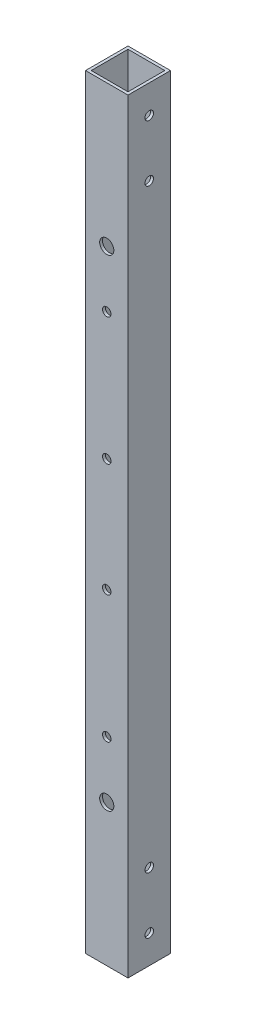
ISO-10303-21;
HEADER;
FILE_DESCRIPTION(('STEP AP214'),'2;1');
FILE_NAME('part.step','',(''),(''),'','','');
FILE_SCHEMA(('AUTOMOTIVE_DESIGN { 1 0 10303 214 1 1 1 1 }'));
ENDSEC;
DATA;
#1=APPLICATION_CONTEXT('core data for automotive mechanical design processes');
#2=APPLICATION_PROTOCOL_DEFINITION('international standard','automotive_design',2000,#1);
#3=PRODUCT_CONTEXT('',#1,'mechanical');
#4=PRODUCT('Part','Part','',(#3));
#5=PRODUCT_RELATED_PRODUCT_CATEGORY('part','',(#4));
#6=PRODUCT_DEFINITION_FORMATION('','',#4);
#7=PRODUCT_DEFINITION_CONTEXT('part definition',#1,'design');
#8=PRODUCT_DEFINITION('design','',#6,#7);
#9=PRODUCT_DEFINITION_SHAPE('','',#8);
#10=(LENGTH_UNIT() NAMED_UNIT(*) SI_UNIT(.MILLI.,.METRE.));
#11=(NAMED_UNIT(*) PLANE_ANGLE_UNIT() SI_UNIT($,.RADIAN.));
#12=(NAMED_UNIT(*) SI_UNIT($,.STERADIAN.) SOLID_ANGLE_UNIT());
#13=UNCERTAINTY_MEASURE_WITH_UNIT(LENGTH_MEASURE(1.E-05),#10,'distance_accuracy_value','');
#14=(GEOMETRIC_REPRESENTATION_CONTEXT(3) GLOBAL_UNCERTAINTY_ASSIGNED_CONTEXT((#13)) GLOBAL_UNIT_ASSIGNED_CONTEXT((#10,
#11,#12)) REPRESENTATION_CONTEXT('',''));
#15=CARTESIAN_POINT('',(0.,0.,0.));
#16=DIRECTION('',(0.,0.,1.));
#17=DIRECTION('',(1.,0.,0.));
#18=AXIS2_PLACEMENT_3D('',#15,#16,#17);
#19=CARTESIAN_POINT('',(0.,270.,0.));
#20=DIRECTION('',(0.,-1.,0.));
#21=DIRECTION('',(0.,0.,-1.));
#22=AXIS2_PLACEMENT_3D('',#19,#20,#21);
#23=PLANE('',#22);
#24=DIRECTION('',(0.,0.,-1.));
#25=VECTOR('',#24,1.);
#26=CARTESIAN_POINT('',(7.5,270.,7.5));
#27=LINE('',#26,#25);
#28=CARTESIAN_POINT('',(7.5,270.,7.5));
#29=VERTEX_POINT('',#28);
#30=CARTESIAN_POINT('',(7.5,270.,-7.5));
#31=VERTEX_POINT('',#30);
#32=EDGE_CURVE('E139',#29,#31,#27,.T.);
#33=ORIENTED_EDGE('',*,*,#32,.T.);
#34=DIRECTION('',(-1.,0.,0.));
#35=VECTOR('',#34,1.);
#36=CARTESIAN_POINT('',(-7.5,270.,-7.5));
#37=LINE('',#36,#35);
#38=CARTESIAN_POINT('',(-7.5,270.,-7.5));
#39=VERTEX_POINT('',#38);
#40=EDGE_CURVE('E142',#31,#39,#37,.T.);
#41=ORIENTED_EDGE('',*,*,#40,.T.);
#42=DIRECTION('',(0.,0.,1.));
#43=VECTOR('',#42,1.);
#44=CARTESIAN_POINT('',(-7.5,270.,7.5));
#45=LINE('',#44,#43);
#46=CARTESIAN_POINT('',(-7.5,270.,7.5));
#47=VERTEX_POINT('',#46);
#48=EDGE_CURVE('E145',#39,#47,#45,.T.);
#49=ORIENTED_EDGE('',*,*,#48,.T.);
#50=DIRECTION('',(1.,0.,0.));
#51=VECTOR('',#50,1.);
#52=CARTESIAN_POINT('',(-7.5,270.,7.5));
#53=LINE('',#52,#51);
#54=EDGE_CURVE('E147',#47,#29,#53,.T.);
#55=ORIENTED_EDGE('',*,*,#54,.T.);
#56=EDGE_LOOP('',(#33,#41,#49,#55));
#57=FACE_BOUND('',#56,.T.);
#58=DIRECTION('',(0.,0.,1.));
#59=VECTOR('',#58,1.);
#60=CARTESIAN_POINT('',(-6.5,270.,6.5));
#61=LINE('',#60,#59);
#62=CARTESIAN_POINT('',(-6.5,270.,-6.5));
#63=VERTEX_POINT('',#62);
#64=CARTESIAN_POINT('',(-6.5,270.,6.5));
#65=VERTEX_POINT('',#64);
#66=EDGE_CURVE('E101',#63,#65,#61,.T.);
#67=ORIENTED_EDGE('',*,*,#66,.F.);
#68=DIRECTION('',(-1.,0.,0.));
#69=VECTOR('',#68,1.);
#70=CARTESIAN_POINT('',(-6.5,270.,-6.5));
#71=LINE('',#70,#69);
#72=CARTESIAN_POINT('',(6.5,270.,-6.5));
#73=VERTEX_POINT('',#72);
#74=EDGE_CURVE('E123',#73,#63,#71,.T.);
#75=ORIENTED_EDGE('',*,*,#74,.F.);
#76=DIRECTION('',(0.,0.,-1.));
#77=VECTOR('',#76,1.);
#78=CARTESIAN_POINT('',(6.5,270.,6.5));
#79=LINE('',#78,#77);
#80=CARTESIAN_POINT('',(6.5,270.,6.5));
#81=VERTEX_POINT('',#80);
#82=EDGE_CURVE('E121',#81,#73,#79,.T.);
#83=ORIENTED_EDGE('',*,*,#82,.F.);
#84=DIRECTION('',(1.,0.,0.));
#85=VECTOR('',#84,1.);
#86=CARTESIAN_POINT('',(-6.5,270.,6.5));
#87=LINE('',#86,#85);
#88=EDGE_CURVE('E109',#65,#81,#87,.T.);
#89=ORIENTED_EDGE('',*,*,#88,.F.);
#90=EDGE_LOOP('',(#67,#75,#83,#89));
#91=FACE_BOUND('',#90,.T.);
#92=ADVANCED_FACE('F34',(#57,#91),#23,.F.);
#93=CARTESIAN_POINT('',(0.,0.,0.));
#94=DIRECTION('',(0.,-1.,0.));
#95=DIRECTION('',(0.,0.,-1.));
#96=AXIS2_PLACEMENT_3D('',#93,#94,#95);
#97=PLANE('',#96);
#98=DIRECTION('',(0.,0.,-1.));
#99=VECTOR('',#98,1.);
#100=CARTESIAN_POINT('',(7.5,0.,7.5));
#101=LINE('',#100,#99);
#102=CARTESIAN_POINT('',(7.5,0.,7.5));
#103=VERTEX_POINT('',#102);
#104=CARTESIAN_POINT('',(7.5,0.,-7.5));
#105=VERTEX_POINT('',#104);
#106=EDGE_CURVE('E117',#103,#105,#101,.T.);
#107=ORIENTED_EDGE('',*,*,#106,.F.);
#108=DIRECTION('',(1.,0.,0.));
#109=VECTOR('',#108,1.);
#110=CARTESIAN_POINT('',(-7.5,0.,7.5));
#111=LINE('',#110,#109);
#112=CARTESIAN_POINT('',(-7.5,0.,7.5));
#113=VERTEX_POINT('',#112);
#114=EDGE_CURVE('E143',#113,#103,#111,.T.);
#115=ORIENTED_EDGE('',*,*,#114,.F.);
#116=DIRECTION('',(0.,0.,1.));
#117=VECTOR('',#116,1.);
#118=CARTESIAN_POINT('',(-7.5,0.,7.5));
#119=LINE('',#118,#117);
#120=CARTESIAN_POINT('',(-7.5,0.,-7.5));
#121=VERTEX_POINT('',#120);
#122=EDGE_CURVE('E154',#121,#113,#119,.T.);
#123=ORIENTED_EDGE('',*,*,#122,.F.);
#124=DIRECTION('',(-1.,0.,0.));
#125=VECTOR('',#124,1.);
#126=CARTESIAN_POINT('',(-7.5,0.,-7.5));
#127=LINE('',#126,#125);
#128=EDGE_CURVE('E152',#105,#121,#127,.T.);
#129=ORIENTED_EDGE('',*,*,#128,.F.);
#130=EDGE_LOOP('',(#107,#115,#123,#129));
#131=FACE_BOUND('',#130,.T.);
#132=DIRECTION('',(-1.,0.,0.));
#133=VECTOR('',#132,1.);
#134=CARTESIAN_POINT('',(-6.5,0.,-6.5));
#135=LINE('',#134,#133);
#136=CARTESIAN_POINT('',(6.5,0.,-6.5));
#137=VERTEX_POINT('',#136);
#138=CARTESIAN_POINT('',(-6.5,0.,-6.5));
#139=VERTEX_POINT('',#138);
#140=EDGE_CURVE('E110',#137,#139,#135,.T.);
#141=ORIENTED_EDGE('',*,*,#140,.T.);
#142=DIRECTION('',(0.,0.,1.));
#143=VECTOR('',#142,1.);
#144=CARTESIAN_POINT('',(-6.5,0.,6.5));
#145=LINE('',#144,#143);
#146=CARTESIAN_POINT('',(-6.5,0.,6.5));
#147=VERTEX_POINT('',#146);
#148=EDGE_CURVE('E59',#139,#147,#145,.T.);
#149=ORIENTED_EDGE('',*,*,#148,.T.);
#150=DIRECTION('',(1.,0.,0.));
#151=VECTOR('',#150,1.);
#152=CARTESIAN_POINT('',(-6.5,0.,6.5));
#153=LINE('',#152,#151);
#154=CARTESIAN_POINT('',(6.5,0.,6.5));
#155=VERTEX_POINT('',#154);
#156=EDGE_CURVE('E116',#147,#155,#153,.T.);
#157=ORIENTED_EDGE('',*,*,#156,.T.);
#158=DIRECTION('',(0.,0.,-1.));
#159=VECTOR('',#158,1.);
#160=CARTESIAN_POINT('',(6.5,0.,6.5));
#161=LINE('',#160,#159);
#162=EDGE_CURVE('E131',#155,#137,#161,.T.);
#163=ORIENTED_EDGE('',*,*,#162,.T.);
#164=EDGE_LOOP('',(#141,#149,#157,#163));
#165=FACE_BOUND('',#164,.T.);
#166=ADVANCED_FACE('F289',(#131,#165),#97,.T.);
#167=CARTESIAN_POINT('',(7.5,270.,7.5));
#168=DIRECTION('',(-1.,0.,0.));
#169=DIRECTION('',(0.,0.,1.));
#170=AXIS2_PLACEMENT_3D('',#167,#168,#169);
#171=PLANE('',#170);
#172=CARTESIAN_POINT('',(7.5,260.,0.));
#173=DIRECTION('',(1.,0.,0.));
#174=DIRECTION('',(0.,0.,-1.));
#175=AXIS2_PLACEMENT_3D('',#172,#173,#174);
#176=CIRCLE('',#175,1.5);
#177=CARTESIAN_POINT('',(7.5,260.,-1.50000000000003));
#178=VERTEX_POINT('',#177);
#179=EDGE_CURVE('E418',#178,#178,#176,.T.);
#180=ORIENTED_EDGE('',*,*,#179,.F.);
#181=EDGE_LOOP('',(#180));
#182=FACE_BOUND('',#181,.T.);
#183=CARTESIAN_POINT('',(7.5,10.,0.));
#184=DIRECTION('',(1.,0.,0.));
#185=DIRECTION('',(0.,0.,-1.));
#186=AXIS2_PLACEMENT_3D('',#183,#184,#185);
#187=CIRCLE('',#186,1.5);
#188=CARTESIAN_POINT('',(7.5,10.,-1.50000000000003));
#189=VERTEX_POINT('',#188);
#190=EDGE_CURVE('E409',#189,#189,#187,.T.);
#191=ORIENTED_EDGE('',*,*,#190,.F.);
#192=EDGE_LOOP('',(#191));
#193=FACE_BOUND('',#192,.T.);
#194=CARTESIAN_POINT('',(7.5,30.,0.));
#195=DIRECTION('',(1.,0.,0.));
#196=DIRECTION('',(0.,0.,-1.));
#197=AXIS2_PLACEMENT_3D('',#194,#195,#196);
#198=CIRCLE('',#197,1.5);
#199=CARTESIAN_POINT('',(7.5,30.,-1.50000000000003));
#200=VERTEX_POINT('',#199);
#201=EDGE_CURVE('E210',#200,#200,#198,.T.);
#202=ORIENTED_EDGE('',*,*,#201,.F.);
#203=EDGE_LOOP('',(#202));
#204=FACE_BOUND('',#203,.T.);
#205=CARTESIAN_POINT('',(7.5,240.,0.));
#206=DIRECTION('',(1.,0.,0.));
#207=DIRECTION('',(0.,0.,-1.));
#208=AXIS2_PLACEMENT_3D('',#205,#206,#207);
#209=CIRCLE('',#208,1.5);
#210=CARTESIAN_POINT('',(7.5,240.,-1.50000000000003));
#211=VERTEX_POINT('',#210);
#212=EDGE_CURVE('E216',#211,#211,#209,.T.);
#213=ORIENTED_EDGE('',*,*,#212,.F.);
#214=EDGE_LOOP('',(#213));
#215=FACE_BOUND('',#214,.T.);
#216=ORIENTED_EDGE('',*,*,#106,.T.);
#217=DIRECTION('',(0.,-1.,0.));
#218=VECTOR('',#217,1.);
#219=CARTESIAN_POINT('',(7.5,270.,-7.5));
#220=LINE('',#219,#218);
#221=EDGE_CURVE('E11',#31,#105,#220,.T.);
#222=ORIENTED_EDGE('',*,*,#221,.F.);
#223=ORIENTED_EDGE('',*,*,#32,.F.);
#224=DIRECTION('',(0.,-1.,0.));
#225=VECTOR('',#224,1.);
#226=CARTESIAN_POINT('',(7.5,270.,7.5));
#227=LINE('',#226,#225);
#228=EDGE_CURVE('E149',#29,#103,#227,.T.);
#229=ORIENTED_EDGE('',*,*,#228,.T.);
#230=EDGE_LOOP('',(#216,#222,#223,#229));
#231=FACE_BOUND('',#230,.T.);
#232=ADVANCED_FACE('F36',(#182,#193,#204,#215,#231),#171,.F.);
#233=CARTESIAN_POINT('',(-7.5,270.,-7.5));
#234=DIRECTION('',(0.,0.,1.));
#235=DIRECTION('',(1.,0.,0.));
#236=AXIS2_PLACEMENT_3D('',#233,#234,#235);
#237=PLANE('',#236);
#238=CARTESIAN_POINT('',(0.,70.,-7.5));
#239=DIRECTION('',(0.,0.,1.));
#240=DIRECTION('',(1.,0.,0.));
#241=AXIS2_PLACEMENT_3D('',#238,#239,#240);
#242=CIRCLE('',#241,1.5);
#243=CARTESIAN_POINT('',(1.50000000000001,70.,-7.5));
#244=VERTEX_POINT('',#243);
#245=EDGE_CURVE('E236',#244,#244,#242,.T.);
#246=ORIENTED_EDGE('',*,*,#245,.T.);
#247=EDGE_LOOP('',(#246));
#248=FACE_BOUND('',#247,.T.);
#249=CARTESIAN_POINT('',(0.,220.,-7.5));
#250=DIRECTION('',(0.,0.,1.));
#251=DIRECTION('',(1.,0.,0.));
#252=AXIS2_PLACEMENT_3D('',#249,#250,#251);
#253=CIRCLE('',#252,2.5);
#254=CARTESIAN_POINT('',(2.50000000000001,220.,-7.5));
#255=VERTEX_POINT('',#254);
#256=EDGE_CURVE('E224',#255,#255,#253,.T.);
#257=ORIENTED_EDGE('',*,*,#256,.T.);
#258=EDGE_LOOP('',(#257));
#259=FACE_BOUND('',#258,.T.);
#260=CARTESIAN_POINT('',(0.,50.,-7.5));
#261=DIRECTION('',(0.,0.,1.));
#262=DIRECTION('',(-1.,0.,0.));
#263=AXIS2_PLACEMENT_3D('',#260,#261,#262);
#264=CIRCLE('',#263,2.5);
#265=CARTESIAN_POINT('',(-2.5,50.,-7.5));
#266=VERTEX_POINT('',#265);
#267=EDGE_CURVE('E231',#266,#266,#264,.T.);
#268=ORIENTED_EDGE('',*,*,#267,.T.);
#269=EDGE_LOOP('',(#268));
#270=FACE_BOUND('',#269,.T.);
#271=CARTESIAN_POINT('',(0.,200.,-7.5));
#272=DIRECTION('',(0.,0.,1.));
#273=DIRECTION('',(1.,0.,0.));
#274=AXIS2_PLACEMENT_3D('',#271,#272,#273);
#275=CIRCLE('',#274,1.5);
#276=CARTESIAN_POINT('',(1.50000000000001,200.,-7.5));
#277=VERTEX_POINT('',#276);
#278=EDGE_CURVE('E247',#277,#277,#275,.T.);
#279=ORIENTED_EDGE('',*,*,#278,.T.);
#280=EDGE_LOOP('',(#279));
#281=FACE_BOUND('',#280,.T.);
#282=CARTESIAN_POINT('',(0.,115.,-7.5));
#283=DIRECTION('',(0.,0.,1.));
#284=DIRECTION('',(1.,0.,0.));
#285=AXIS2_PLACEMENT_3D('',#282,#283,#284);
#286=CIRCLE('',#285,1.5);
#287=CARTESIAN_POINT('',(1.50000000000002,115.,-7.5));
#288=VERTEX_POINT('',#287);
#289=EDGE_CURVE('E172',#288,#288,#286,.T.);
#290=ORIENTED_EDGE('',*,*,#289,.T.);
#291=EDGE_LOOP('',(#290));
#292=FACE_BOUND('',#291,.T.);
#293=CARTESIAN_POINT('',(0.,155.,-7.5));
#294=DIRECTION('',(0.,0.,1.));
#295=DIRECTION('',(1.,0.,0.));
#296=AXIS2_PLACEMENT_3D('',#293,#294,#295);
#297=CIRCLE('',#296,1.5);
#298=CARTESIAN_POINT('',(1.50000000000002,155.,-7.5));
#299=VERTEX_POINT('',#298);
#300=EDGE_CURVE('E167',#299,#299,#297,.T.);
#301=ORIENTED_EDGE('',*,*,#300,.T.);
#302=EDGE_LOOP('',(#301));
#303=FACE_BOUND('',#302,.T.);
#304=ORIENTED_EDGE('',*,*,#128,.T.);
#305=DIRECTION('',(0.,-1.,0.));
#306=VECTOR('',#305,1.);
#307=CARTESIAN_POINT('',(-7.5,270.,-7.5));
#308=LINE('',#307,#306);
#309=EDGE_CURVE('E43',#39,#121,#308,.T.);
#310=ORIENTED_EDGE('',*,*,#309,.F.);
#311=ORIENTED_EDGE('',*,*,#40,.F.);
#312=ORIENTED_EDGE('',*,*,#221,.T.);
#313=EDGE_LOOP('',(#304,#310,#311,#312));
#314=FACE_BOUND('',#313,.T.);
#315=ADVANCED_FACE('F303',(#248,#259,#270,#281,#292,#303,#314),#237,.F.);
#316=CARTESIAN_POINT('',(-7.5,270.,7.5));
#317=DIRECTION('',(1.,0.,0.));
#318=DIRECTION('',(0.,0.,-1.));
#319=AXIS2_PLACEMENT_3D('',#316,#317,#318);
#320=PLANE('',#319);
#321=CARTESIAN_POINT('',(-7.5,260.,0.));
#322=DIRECTION('',(1.,0.,0.));
#323=DIRECTION('',(0.,0.,-1.));
#324=AXIS2_PLACEMENT_3D('',#321,#322,#323);
#325=CIRCLE('',#324,1.5);
#326=CARTESIAN_POINT('',(-7.5,260.,-1.50000000000003));
#327=VERTEX_POINT('',#326);
#328=EDGE_CURVE('E413',#327,#327,#325,.T.);
#329=ORIENTED_EDGE('',*,*,#328,.T.);
#330=EDGE_LOOP('',(#329));
#331=FACE_BOUND('',#330,.T.);
#332=CARTESIAN_POINT('',(-7.5,10.,0.));
#333=DIRECTION('',(1.,0.,0.));
#334=DIRECTION('',(0.,0.,-1.));
#335=AXIS2_PLACEMENT_3D('',#332,#333,#334);
#336=CIRCLE('',#335,1.5);
#337=CARTESIAN_POINT('',(-7.5,10.,-1.50000000000003));
#338=VERTEX_POINT('',#337);
#339=EDGE_CURVE('E407',#338,#338,#336,.T.);
#340=ORIENTED_EDGE('',*,*,#339,.T.);
#341=EDGE_LOOP('',(#340));
#342=FACE_BOUND('',#341,.T.);
#343=CARTESIAN_POINT('',(-7.5,30.,0.));
#344=DIRECTION('',(1.,0.,0.));
#345=DIRECTION('',(0.,0.,-1.));
#346=AXIS2_PLACEMENT_3D('',#343,#344,#345);
#347=CIRCLE('',#346,1.5);
#348=CARTESIAN_POINT('',(-7.5,30.,-1.50000000000003));
#349=VERTEX_POINT('',#348);
#350=EDGE_CURVE('E197',#349,#349,#347,.T.);
#351=ORIENTED_EDGE('',*,*,#350,.T.);
#352=EDGE_LOOP('',(#351));
#353=FACE_BOUND('',#352,.T.);
#354=CARTESIAN_POINT('',(-7.5,240.,0.));
#355=DIRECTION('',(1.,0.,0.));
#356=DIRECTION('',(0.,0.,-1.));
#357=AXIS2_PLACEMENT_3D('',#354,#355,#356);
#358=CIRCLE('',#357,1.5);
#359=CARTESIAN_POINT('',(-7.5,240.,-1.50000000000003));
#360=VERTEX_POINT('',#359);
#361=EDGE_CURVE('E193',#360,#360,#358,.T.);
#362=ORIENTED_EDGE('',*,*,#361,.T.);
#363=EDGE_LOOP('',(#362));
#364=FACE_BOUND('',#363,.T.);
#365=ORIENTED_EDGE('',*,*,#122,.T.);
#366=DIRECTION('',(0.,-1.,0.));
#367=VECTOR('',#366,1.);
#368=CARTESIAN_POINT('',(-7.5,270.,7.5));
#369=LINE('',#368,#367);
#370=EDGE_CURVE('E159',#47,#113,#369,.T.);
#371=ORIENTED_EDGE('',*,*,#370,.F.);
#372=ORIENTED_EDGE('',*,*,#48,.F.);
#373=ORIENTED_EDGE('',*,*,#309,.T.);
#374=EDGE_LOOP('',(#365,#371,#372,#373));
#375=FACE_BOUND('',#374,.T.);
#376=ADVANCED_FACE('F300',(#331,#342,#353,#364,#375),#320,.F.);
#377=CARTESIAN_POINT('',(-7.5,270.,7.5));
#378=DIRECTION('',(0.,0.,-1.));
#379=DIRECTION('',(-1.,0.,0.));
#380=AXIS2_PLACEMENT_3D('',#377,#378,#379);
#381=PLANE('',#380);
#382=CARTESIAN_POINT('',(0.,70.,7.5));
#383=DIRECTION('',(0.,0.,1.));
#384=DIRECTION('',(1.,0.,0.));
#385=AXIS2_PLACEMENT_3D('',#382,#383,#384);
#386=CIRCLE('',#385,1.5);
#387=CARTESIAN_POINT('',(1.50000000000001,70.,7.5));
#388=VERTEX_POINT('',#387);
#389=EDGE_CURVE('E227',#388,#388,#386,.T.);
#390=ORIENTED_EDGE('',*,*,#389,.F.);
#391=EDGE_LOOP('',(#390));
#392=FACE_BOUND('',#391,.T.);
#393=CARTESIAN_POINT('',(0.,220.,7.5));
#394=DIRECTION('',(0.,0.,1.));
#395=DIRECTION('',(1.,0.,0.));
#396=AXIS2_PLACEMENT_3D('',#393,#394,#395);
#397=CIRCLE('',#396,2.5);
#398=CARTESIAN_POINT('',(2.50000000000001,220.,7.5));
#399=VERTEX_POINT('',#398);
#400=EDGE_CURVE('E228',#399,#399,#397,.T.);
#401=ORIENTED_EDGE('',*,*,#400,.F.);
#402=EDGE_LOOP('',(#401));
#403=FACE_BOUND('',#402,.T.);
#404=CARTESIAN_POINT('',(0.,50.,7.5));
#405=DIRECTION('',(0.,0.,1.));
#406=DIRECTION('',(-1.,0.,0.));
#407=AXIS2_PLACEMENT_3D('',#404,#405,#406);
#408=CIRCLE('',#407,2.5);
#409=CARTESIAN_POINT('',(-2.5,50.,7.5));
#410=VERTEX_POINT('',#409);
#411=EDGE_CURVE('E223',#410,#410,#408,.T.);
#412=ORIENTED_EDGE('',*,*,#411,.F.);
#413=EDGE_LOOP('',(#412));
#414=FACE_BOUND('',#413,.T.);
#415=CARTESIAN_POINT('',(0.,200.,7.5));
#416=DIRECTION('',(0.,0.,1.));
#417=DIRECTION('',(1.,0.,0.));
#418=AXIS2_PLACEMENT_3D('',#415,#416,#417);
#419=CIRCLE('',#418,1.5);
#420=CARTESIAN_POINT('',(1.50000000000001,200.,7.5));
#421=VERTEX_POINT('',#420);
#422=EDGE_CURVE('E239',#421,#421,#419,.T.);
#423=ORIENTED_EDGE('',*,*,#422,.F.);
#424=EDGE_LOOP('',(#423));
#425=FACE_BOUND('',#424,.T.);
#426=CARTESIAN_POINT('',(0.,115.,7.5));
#427=DIRECTION('',(0.,0.,1.));
#428=DIRECTION('',(1.,0.,0.));
#429=AXIS2_PLACEMENT_3D('',#426,#427,#428);
#430=CIRCLE('',#429,1.5);
#431=CARTESIAN_POINT('',(1.50000000000002,115.,7.5));
#432=VERTEX_POINT('',#431);
#433=EDGE_CURVE('E244',#432,#432,#430,.T.);
#434=ORIENTED_EDGE('',*,*,#433,.F.);
#435=EDGE_LOOP('',(#434));
#436=FACE_BOUND('',#435,.T.);
#437=CARTESIAN_POINT('',(0.,155.,7.5));
#438=DIRECTION('',(0.,0.,1.));
#439=DIRECTION('',(1.,0.,0.));
#440=AXIS2_PLACEMENT_3D('',#437,#438,#439);
#441=CIRCLE('',#440,1.5);
#442=CARTESIAN_POINT('',(1.50000000000002,155.,7.5));
#443=VERTEX_POINT('',#442);
#444=EDGE_CURVE('E262',#443,#443,#441,.T.);
#445=ORIENTED_EDGE('',*,*,#444,.F.);
#446=EDGE_LOOP('',(#445));
#447=FACE_BOUND('',#446,.T.);
#448=ORIENTED_EDGE('',*,*,#114,.T.);
#449=ORIENTED_EDGE('',*,*,#228,.F.);
#450=ORIENTED_EDGE('',*,*,#54,.F.);
#451=ORIENTED_EDGE('',*,*,#370,.T.);
#452=EDGE_LOOP('',(#448,#449,#450,#451));
#453=FACE_BOUND('',#452,.T.);
#454=ADVANCED_FACE('F283',(#392,#403,#414,#425,#436,#447,#453),#381,.F.);
#455=CARTESIAN_POINT('',(-6.5,270.,6.5));
#456=DIRECTION('',(1.,0.,0.));
#457=DIRECTION('',(0.,0.,-1.));
#458=AXIS2_PLACEMENT_3D('',#455,#456,#457);
#459=PLANE('',#458);
#460=CARTESIAN_POINT('',(-6.5,260.,0.));
#461=DIRECTION('',(1.,0.,0.));
#462=DIRECTION('',(0.,0.,-1.));
#463=AXIS2_PLACEMENT_3D('',#460,#461,#462);
#464=CIRCLE('',#463,1.5);
#465=CARTESIAN_POINT('',(-6.5,260.,-1.50000000000003));
#466=VERTEX_POINT('',#465);
#467=EDGE_CURVE('E213',#466,#466,#464,.T.);
#468=ORIENTED_EDGE('',*,*,#467,.F.);
#469=EDGE_LOOP('',(#468));
#470=FACE_BOUND('',#469,.T.);
#471=CARTESIAN_POINT('',(-6.5,10.,0.));
#472=DIRECTION('',(1.,0.,0.));
#473=DIRECTION('',(0.,0.,-1.));
#474=AXIS2_PLACEMENT_3D('',#471,#472,#473);
#475=CIRCLE('',#474,1.5);
#476=CARTESIAN_POINT('',(-6.5,10.,-1.50000000000003));
#477=VERTEX_POINT('',#476);
#478=EDGE_CURVE('E200',#477,#477,#475,.T.);
#479=ORIENTED_EDGE('',*,*,#478,.F.);
#480=EDGE_LOOP('',(#479));
#481=FACE_BOUND('',#480,.T.);
#482=CARTESIAN_POINT('',(-6.5,30.,0.));
#483=DIRECTION('',(1.,0.,0.));
#484=DIRECTION('',(0.,0.,-1.));
#485=AXIS2_PLACEMENT_3D('',#482,#483,#484);
#486=CIRCLE('',#485,1.5);
#487=CARTESIAN_POINT('',(-6.5,30.,-1.50000000000003));
#488=VERTEX_POINT('',#487);
#489=EDGE_CURVE('E196',#488,#488,#486,.T.);
#490=ORIENTED_EDGE('',*,*,#489,.F.);
#491=EDGE_LOOP('',(#490));
#492=FACE_BOUND('',#491,.T.);
#493=CARTESIAN_POINT('',(-6.5,240.,0.));
#494=DIRECTION('',(1.,0.,0.));
#495=DIRECTION('',(0.,0.,-1.));
#496=AXIS2_PLACEMENT_3D('',#493,#494,#495);
#497=CIRCLE('',#496,1.5);
#498=CARTESIAN_POINT('',(-6.5,240.,-1.50000000000003));
#499=VERTEX_POINT('',#498);
#500=EDGE_CURVE('E192',#499,#499,#497,.T.);
#501=ORIENTED_EDGE('',*,*,#500,.F.);
#502=EDGE_LOOP('',(#501));
#503=FACE_BOUND('',#502,.T.);
#504=ORIENTED_EDGE('',*,*,#148,.F.);
#505=DIRECTION('',(0.,-1.,0.));
#506=VECTOR('',#505,1.);
#507=CARTESIAN_POINT('',(-6.5,270.,-6.5));
#508=LINE('',#507,#506);
#509=EDGE_CURVE('E105',#63,#139,#508,.T.);
#510=ORIENTED_EDGE('',*,*,#509,.F.);
#511=ORIENTED_EDGE('',*,*,#66,.T.);
#512=DIRECTION('',(0.,-1.,0.));
#513=VECTOR('',#512,1.);
#514=CARTESIAN_POINT('',(-6.5,270.,6.5));
#515=LINE('',#514,#513);
#516=EDGE_CURVE('E104',#65,#147,#515,.T.);
#517=ORIENTED_EDGE('',*,*,#516,.T.);
#518=EDGE_LOOP('',(#504,#510,#511,#517));
#519=FACE_BOUND('',#518,.T.);
#520=ADVANCED_FACE('F103',(#470,#481,#492,#503,#519),#459,.T.);
#521=CARTESIAN_POINT('',(-6.5,270.,6.5));
#522=DIRECTION('',(0.,0.,-1.));
#523=DIRECTION('',(-1.,0.,0.));
#524=AXIS2_PLACEMENT_3D('',#521,#522,#523);
#525=PLANE('',#524);
#526=CARTESIAN_POINT('',(0.,70.,6.5));
#527=DIRECTION('',(0.,0.,-1.));
#528=DIRECTION('',(-1.,0.,0.));
#529=AXIS2_PLACEMENT_3D('',#526,#527,#528);
#530=CIRCLE('',#529,1.5);
#531=CARTESIAN_POINT('',(-1.49999999999999,70.,6.5));
#532=VERTEX_POINT('',#531);
#533=EDGE_CURVE('E188',#532,#532,#530,.T.);
#534=ORIENTED_EDGE('',*,*,#533,.F.);
#535=EDGE_LOOP('',(#534));
#536=FACE_BOUND('',#535,.T.);
#537=CARTESIAN_POINT('',(0.,220.,6.5));
#538=DIRECTION('',(0.,0.,-1.));
#539=DIRECTION('',(-1.,0.,0.));
#540=AXIS2_PLACEMENT_3D('',#537,#538,#539);
#541=CIRCLE('',#540,2.5);
#542=CARTESIAN_POINT('',(-2.5,220.,6.5));
#543=VERTEX_POINT('',#542);
#544=EDGE_CURVE('E184',#543,#543,#541,.T.);
#545=ORIENTED_EDGE('',*,*,#544,.F.);
#546=EDGE_LOOP('',(#545));
#547=FACE_BOUND('',#546,.T.);
#548=CARTESIAN_POINT('',(0.,50.,6.5));
#549=DIRECTION('',(0.,0.,-1.));
#550=DIRECTION('',(-1.,0.,0.));
#551=AXIS2_PLACEMENT_3D('',#548,#549,#550);
#552=CIRCLE('',#551,2.5);
#553=CARTESIAN_POINT('',(-2.5,50.,6.5));
#554=VERTEX_POINT('',#553);
#555=EDGE_CURVE('E180',#554,#554,#552,.T.);
#556=ORIENTED_EDGE('',*,*,#555,.F.);
#557=EDGE_LOOP('',(#556));
#558=FACE_BOUND('',#557,.T.);
#559=CARTESIAN_POINT('',(0.,200.,6.5));
#560=DIRECTION('',(0.,0.,-1.));
#561=DIRECTION('',(-1.,0.,0.));
#562=AXIS2_PLACEMENT_3D('',#559,#560,#561);
#563=CIRCLE('',#562,1.5);
#564=CARTESIAN_POINT('',(-1.49999999999999,200.,6.5));
#565=VERTEX_POINT('',#564);
#566=EDGE_CURVE('E176',#565,#565,#563,.T.);
#567=ORIENTED_EDGE('',*,*,#566,.F.);
#568=EDGE_LOOP('',(#567));
#569=FACE_BOUND('',#568,.T.);
#570=CARTESIAN_POINT('',(0.,115.,6.5));
#571=DIRECTION('',(0.,0.,-1.));
#572=DIRECTION('',(-1.,0.,0.));
#573=AXIS2_PLACEMENT_3D('',#570,#571,#572);
#574=CIRCLE('',#573,1.5);
#575=CARTESIAN_POINT('',(-1.49999999999998,115.,6.5));
#576=VERTEX_POINT('',#575);
#577=EDGE_CURVE('E171',#576,#576,#574,.T.);
#578=ORIENTED_EDGE('',*,*,#577,.F.);
#579=EDGE_LOOP('',(#578));
#580=FACE_BOUND('',#579,.T.);
#581=CARTESIAN_POINT('',(0.,155.,6.5));
#582=DIRECTION('',(0.,0.,-1.));
#583=DIRECTION('',(-1.,0.,0.));
#584=AXIS2_PLACEMENT_3D('',#581,#582,#583);
#585=CIRCLE('',#584,1.5);
#586=CARTESIAN_POINT('',(-1.49999999999998,155.,6.5));
#587=VERTEX_POINT('',#586);
#588=EDGE_CURVE('E129',#587,#587,#585,.T.);
#589=ORIENTED_EDGE('',*,*,#588,.F.);
#590=EDGE_LOOP('',(#589));
#591=FACE_BOUND('',#590,.T.);
#592=ORIENTED_EDGE('',*,*,#156,.F.);
#593=ORIENTED_EDGE('',*,*,#516,.F.);
#594=ORIENTED_EDGE('',*,*,#88,.T.);
#595=DIRECTION('',(0.,-1.,0.));
#596=VECTOR('',#595,1.);
#597=CARTESIAN_POINT('',(6.5,270.,6.5));
#598=LINE('',#597,#596);
#599=EDGE_CURVE('E118',#81,#155,#598,.T.);
#600=ORIENTED_EDGE('',*,*,#599,.T.);
#601=EDGE_LOOP('',(#592,#593,#594,#600));
#602=FACE_BOUND('',#601,.T.);
#603=ADVANCED_FACE('F113',(#536,#547,#558,#569,#580,#591,#602),#525,.T.);
#604=CARTESIAN_POINT('',(6.5,270.,6.5));
#605=DIRECTION('',(-1.,0.,0.));
#606=DIRECTION('',(0.,0.,1.));
#607=AXIS2_PLACEMENT_3D('',#604,#605,#606);
#608=PLANE('',#607);
#609=CARTESIAN_POINT('',(6.5,260.,0.));
#610=DIRECTION('',(-1.,0.,0.));
#611=DIRECTION('',(0.,0.,1.));
#612=AXIS2_PLACEMENT_3D('',#609,#610,#611);
#613=CIRCLE('',#612,1.5);
#614=CARTESIAN_POINT('',(6.5,260.,1.49999999999997));
#615=VERTEX_POINT('',#614);
#616=EDGE_CURVE('E38',#615,#615,#613,.T.);
#617=ORIENTED_EDGE('',*,*,#616,.F.);
#618=EDGE_LOOP('',(#617));
#619=FACE_BOUND('',#618,.T.);
#620=CARTESIAN_POINT('',(6.5,10.,0.));
#621=DIRECTION('',(-1.,0.,0.));
#622=DIRECTION('',(0.,0.,1.));
#623=AXIS2_PLACEMENT_3D('',#620,#621,#622);
#624=CIRCLE('',#623,1.5);
#625=CARTESIAN_POINT('',(6.5,10.,1.49999999999997));
#626=VERTEX_POINT('',#625);
#627=EDGE_CURVE('E198',#626,#626,#624,.T.);
#628=ORIENTED_EDGE('',*,*,#627,.F.);
#629=EDGE_LOOP('',(#628));
#630=FACE_BOUND('',#629,.T.);
#631=CARTESIAN_POINT('',(6.5,30.,0.));
#632=DIRECTION('',(-1.,0.,0.));
#633=DIRECTION('',(0.,0.,1.));
#634=AXIS2_PLACEMENT_3D('',#631,#632,#633);
#635=CIRCLE('',#634,1.5);
#636=CARTESIAN_POINT('',(6.5,30.,1.49999999999997));
#637=VERTEX_POINT('',#636);
#638=EDGE_CURVE('E194',#637,#637,#635,.T.);
#639=ORIENTED_EDGE('',*,*,#638,.F.);
#640=EDGE_LOOP('',(#639));
#641=FACE_BOUND('',#640,.T.);
#642=CARTESIAN_POINT('',(6.5,240.,0.));
#643=DIRECTION('',(-1.,0.,0.));
#644=DIRECTION('',(0.,0.,1.));
#645=AXIS2_PLACEMENT_3D('',#642,#643,#644);
#646=CIRCLE('',#645,1.5);
#647=CARTESIAN_POINT('',(6.5,240.,1.49999999999997));
#648=VERTEX_POINT('',#647);
#649=EDGE_CURVE('E189',#648,#648,#646,.T.);
#650=ORIENTED_EDGE('',*,*,#649,.F.);
#651=EDGE_LOOP('',(#650));
#652=FACE_BOUND('',#651,.T.);
#653=ORIENTED_EDGE('',*,*,#162,.F.);
#654=ORIENTED_EDGE('',*,*,#599,.F.);
#655=ORIENTED_EDGE('',*,*,#82,.T.);
#656=DIRECTION('',(0.,-1.,0.));
#657=VECTOR('',#656,1.);
#658=CARTESIAN_POINT('',(6.5,270.,-6.5));
#659=LINE('',#658,#657);
#660=EDGE_CURVE('E51',#73,#137,#659,.T.);
#661=ORIENTED_EDGE('',*,*,#660,.T.);
#662=EDGE_LOOP('',(#653,#654,#655,#661));
#663=FACE_BOUND('',#662,.T.);
#664=ADVANCED_FACE('F273',(#619,#630,#641,#652,#663),#608,.T.);
#665=CARTESIAN_POINT('',(-6.5,270.,-6.5));
#666=DIRECTION('',(0.,0.,1.));
#667=DIRECTION('',(1.,0.,0.));
#668=AXIS2_PLACEMENT_3D('',#665,#666,#667);
#669=PLANE('',#668);
#670=CARTESIAN_POINT('',(0.,70.,-6.5));
#671=DIRECTION('',(0.,0.,1.));
#672=DIRECTION('',(1.,0.,0.));
#673=AXIS2_PLACEMENT_3D('',#670,#671,#672);
#674=CIRCLE('',#673,1.5);
#675=CARTESIAN_POINT('',(1.50000000000001,70.,-6.5));
#676=VERTEX_POINT('',#675);
#677=EDGE_CURVE('E185',#676,#676,#674,.T.);
#678=ORIENTED_EDGE('',*,*,#677,.F.);
#679=EDGE_LOOP('',(#678));
#680=FACE_BOUND('',#679,.T.);
#681=CARTESIAN_POINT('',(0.,220.,-6.5));
#682=DIRECTION('',(0.,0.,1.));
#683=DIRECTION('',(1.,0.,0.));
#684=AXIS2_PLACEMENT_3D('',#681,#682,#683);
#685=CIRCLE('',#684,2.5);
#686=CARTESIAN_POINT('',(2.50000000000001,220.,-6.5));
#687=VERTEX_POINT('',#686);
#688=EDGE_CURVE('E181',#687,#687,#685,.T.);
#689=ORIENTED_EDGE('',*,*,#688,.F.);
#690=EDGE_LOOP('',(#689));
#691=FACE_BOUND('',#690,.T.);
#692=CARTESIAN_POINT('',(0.,50.,-6.5));
#693=DIRECTION('',(0.,0.,1.));
#694=DIRECTION('',(1.,0.,0.));
#695=AXIS2_PLACEMENT_3D('',#692,#693,#694);
#696=CIRCLE('',#695,2.5);
#697=CARTESIAN_POINT('',(2.50000000000001,50.,-6.5));
#698=VERTEX_POINT('',#697);
#699=EDGE_CURVE('E177',#698,#698,#696,.T.);
#700=ORIENTED_EDGE('',*,*,#699,.F.);
#701=EDGE_LOOP('',(#700));
#702=FACE_BOUND('',#701,.T.);
#703=CARTESIAN_POINT('',(0.,200.,-6.5));
#704=DIRECTION('',(0.,0.,1.));
#705=DIRECTION('',(1.,0.,0.));
#706=AXIS2_PLACEMENT_3D('',#703,#704,#705);
#707=CIRCLE('',#706,1.5);
#708=CARTESIAN_POINT('',(1.50000000000001,200.,-6.5));
#709=VERTEX_POINT('',#708);
#710=EDGE_CURVE('E173',#709,#709,#707,.T.);
#711=ORIENTED_EDGE('',*,*,#710,.F.);
#712=EDGE_LOOP('',(#711));
#713=FACE_BOUND('',#712,.T.);
#714=CARTESIAN_POINT('',(0.,115.,-6.5));
#715=DIRECTION('',(0.,0.,1.));
#716=DIRECTION('',(1.,0.,0.));
#717=AXIS2_PLACEMENT_3D('',#714,#715,#716);
#718=CIRCLE('',#717,1.5);
#719=CARTESIAN_POINT('',(1.50000000000002,115.,-6.5));
#720=VERTEX_POINT('',#719);
#721=EDGE_CURVE('E168',#720,#720,#718,.T.);
#722=ORIENTED_EDGE('',*,*,#721,.F.);
#723=EDGE_LOOP('',(#722));
#724=FACE_BOUND('',#723,.T.);
#725=CARTESIAN_POINT('',(0.,155.,-6.5));
#726=DIRECTION('',(0.,0.,1.));
#727=DIRECTION('',(1.,0.,0.));
#728=AXIS2_PLACEMENT_3D('',#725,#726,#727);
#729=CIRCLE('',#728,1.5);
#730=CARTESIAN_POINT('',(1.50000000000002,155.,-6.5));
#731=VERTEX_POINT('',#730);
#732=EDGE_CURVE('E164',#731,#731,#729,.T.);
#733=ORIENTED_EDGE('',*,*,#732,.F.);
#734=EDGE_LOOP('',(#733));
#735=FACE_BOUND('',#734,.T.);
#736=ORIENTED_EDGE('',*,*,#140,.F.);
#737=ORIENTED_EDGE('',*,*,#660,.F.);
#738=ORIENTED_EDGE('',*,*,#74,.T.);
#739=ORIENTED_EDGE('',*,*,#509,.T.);
#740=EDGE_LOOP('',(#736,#737,#738,#739));
#741=FACE_BOUND('',#740,.T.);
#742=ADVANCED_FACE('F280',(#680,#691,#702,#713,#724,#735,#741),#669,.T.);
#743=CARTESIAN_POINT('',(0.,155.,-7.5));
#744=DIRECTION('',(0.,0.,1.));
#745=DIRECTION('',(1.,0.,0.));
#746=AXIS2_PLACEMENT_3D('',#743,#744,#745);
#747=CYLINDRICAL_SURFACE('',#746,1.5);
#748=ORIENTED_EDGE('',*,*,#732,.T.);
#749=EDGE_LOOP('',(#748));
#750=FACE_BOUND('',#749,.T.);
#751=ORIENTED_EDGE('',*,*,#300,.F.);
#752=EDGE_LOOP('',(#751));
#753=FACE_BOUND('',#752,.T.);
#754=ADVANCED_FACE('F339',(#750,#753),#747,.F.);
#755=ORIENTED_EDGE('',*,*,#588,.T.);
#756=EDGE_LOOP('',(#755));
#757=FACE_BOUND('',#756,.T.);
#758=ORIENTED_EDGE('',*,*,#444,.T.);
#759=EDGE_LOOP('',(#758));
#760=FACE_BOUND('',#759,.T.);
#761=ADVANCED_FACE('F269',(#757,#760),#747,.F.);
#762=CARTESIAN_POINT('',(0.,115.,-7.5));
#763=DIRECTION('',(0.,0.,1.));
#764=DIRECTION('',(1.,0.,0.));
#765=AXIS2_PLACEMENT_3D('',#762,#763,#764);
#766=CYLINDRICAL_SURFACE('',#765,1.5);
#767=ORIENTED_EDGE('',*,*,#721,.T.);
#768=EDGE_LOOP('',(#767));
#769=FACE_BOUND('',#768,.T.);
#770=ORIENTED_EDGE('',*,*,#289,.F.);
#771=EDGE_LOOP('',(#770));
#772=FACE_BOUND('',#771,.T.);
#773=ADVANCED_FACE('F354',(#769,#772),#766,.F.);
#774=CARTESIAN_POINT('',(0.,200.,-7.5));
#775=DIRECTION('',(0.,0.,1.));
#776=DIRECTION('',(1.,0.,0.));
#777=AXIS2_PLACEMENT_3D('',#774,#775,#776);
#778=CYLINDRICAL_SURFACE('',#777,1.5);
#779=ORIENTED_EDGE('',*,*,#710,.T.);
#780=EDGE_LOOP('',(#779));
#781=FACE_BOUND('',#780,.T.);
#782=ORIENTED_EDGE('',*,*,#278,.F.);
#783=EDGE_LOOP('',(#782));
#784=FACE_BOUND('',#783,.T.);
#785=ADVANCED_FACE('F350',(#781,#784),#778,.F.);
#786=CARTESIAN_POINT('',(0.,50.,-7.5));
#787=DIRECTION('',(0.,0.,1.));
#788=DIRECTION('',(1.,0.,0.));
#789=AXIS2_PLACEMENT_3D('',#786,#787,#788);
#790=CYLINDRICAL_SURFACE('',#789,2.5);
#791=ORIENTED_EDGE('',*,*,#699,.T.);
#792=EDGE_LOOP('',(#791));
#793=FACE_BOUND('',#792,.T.);
#794=ORIENTED_EDGE('',*,*,#267,.F.);
#795=EDGE_LOOP('',(#794));
#796=FACE_BOUND('',#795,.T.);
#797=ADVANCED_FACE('F353',(#793,#796),#790,.F.);
#798=CARTESIAN_POINT('',(0.,220.,-7.5));
#799=DIRECTION('',(0.,0.,1.));
#800=DIRECTION('',(1.,0.,0.));
#801=AXIS2_PLACEMENT_3D('',#798,#799,#800);
#802=CYLINDRICAL_SURFACE('',#801,2.5);
#803=ORIENTED_EDGE('',*,*,#688,.T.);
#804=EDGE_LOOP('',(#803));
#805=FACE_BOUND('',#804,.T.);
#806=ORIENTED_EDGE('',*,*,#256,.F.);
#807=EDGE_LOOP('',(#806));
#808=FACE_BOUND('',#807,.T.);
#809=ADVANCED_FACE('F364',(#805,#808),#802,.F.);
#810=CARTESIAN_POINT('',(0.,70.,-7.5));
#811=DIRECTION('',(0.,0.,1.));
#812=DIRECTION('',(1.,0.,0.));
#813=AXIS2_PLACEMENT_3D('',#810,#811,#812);
#814=CYLINDRICAL_SURFACE('',#813,1.5);
#815=ORIENTED_EDGE('',*,*,#677,.T.);
#816=EDGE_LOOP('',(#815));
#817=FACE_BOUND('',#816,.T.);
#818=ORIENTED_EDGE('',*,*,#245,.F.);
#819=EDGE_LOOP('',(#818));
#820=FACE_BOUND('',#819,.T.);
#821=ADVANCED_FACE('F361',(#817,#820),#814,.F.);
#822=ORIENTED_EDGE('',*,*,#577,.T.);
#823=EDGE_LOOP('',(#822));
#824=FACE_BOUND('',#823,.T.);
#825=ORIENTED_EDGE('',*,*,#433,.T.);
#826=EDGE_LOOP('',(#825));
#827=FACE_BOUND('',#826,.T.);
#828=ADVANCED_FACE('F360',(#824,#827),#766,.F.);
#829=ORIENTED_EDGE('',*,*,#566,.T.);
#830=EDGE_LOOP('',(#829));
#831=FACE_BOUND('',#830,.T.);
#832=ORIENTED_EDGE('',*,*,#422,.T.);
#833=EDGE_LOOP('',(#832));
#834=FACE_BOUND('',#833,.T.);
#835=ADVANCED_FACE('F356',(#831,#834),#778,.F.);
#836=ORIENTED_EDGE('',*,*,#555,.T.);
#837=EDGE_LOOP('',(#836));
#838=FACE_BOUND('',#837,.T.);
#839=ORIENTED_EDGE('',*,*,#411,.T.);
#840=EDGE_LOOP('',(#839));
#841=FACE_BOUND('',#840,.T.);
#842=ADVANCED_FACE('F370',(#838,#841),#790,.F.);
#843=ORIENTED_EDGE('',*,*,#544,.T.);
#844=EDGE_LOOP('',(#843));
#845=FACE_BOUND('',#844,.T.);
#846=ORIENTED_EDGE('',*,*,#400,.T.);
#847=EDGE_LOOP('',(#846));
#848=FACE_BOUND('',#847,.T.);
#849=ADVANCED_FACE('F374',(#845,#848),#802,.F.);
#850=ORIENTED_EDGE('',*,*,#533,.T.);
#851=EDGE_LOOP('',(#850));
#852=FACE_BOUND('',#851,.T.);
#853=ORIENTED_EDGE('',*,*,#389,.T.);
#854=EDGE_LOOP('',(#853));
#855=FACE_BOUND('',#854,.T.);
#856=ADVANCED_FACE('F366',(#852,#855),#814,.F.);
#857=CARTESIAN_POINT('',(-7.5,240.,0.));
#858=DIRECTION('',(1.,0.,0.));
#859=DIRECTION('',(0.,0.,-1.));
#860=AXIS2_PLACEMENT_3D('',#857,#858,#859);
#861=CYLINDRICAL_SURFACE('',#860,1.5);
#862=ORIENTED_EDGE('',*,*,#649,.T.);
#863=EDGE_LOOP('',(#862));
#864=FACE_BOUND('',#863,.T.);
#865=ORIENTED_EDGE('',*,*,#212,.T.);
#866=EDGE_LOOP('',(#865));
#867=FACE_BOUND('',#866,.T.);
#868=ADVANCED_FACE('F375',(#864,#867),#861,.F.);
#869=ORIENTED_EDGE('',*,*,#500,.T.);
#870=EDGE_LOOP('',(#869));
#871=FACE_BOUND('',#870,.T.);
#872=ORIENTED_EDGE('',*,*,#361,.F.);
#873=EDGE_LOOP('',(#872));
#874=FACE_BOUND('',#873,.T.);
#875=ADVANCED_FACE('F378',(#871,#874),#861,.F.);
#876=CARTESIAN_POINT('',(-7.5,30.,0.));
#877=DIRECTION('',(1.,0.,0.));
#878=DIRECTION('',(0.,0.,-1.));
#879=AXIS2_PLACEMENT_3D('',#876,#877,#878);
#880=CYLINDRICAL_SURFACE('',#879,1.5);
#881=ORIENTED_EDGE('',*,*,#638,.T.);
#882=EDGE_LOOP('',(#881));
#883=FACE_BOUND('',#882,.T.);
#884=ORIENTED_EDGE('',*,*,#201,.T.);
#885=EDGE_LOOP('',(#884));
#886=FACE_BOUND('',#885,.T.);
#887=ADVANCED_FACE('F380',(#883,#886),#880,.F.);
#888=CARTESIAN_POINT('',(-7.5,10.,0.));
#889=DIRECTION('',(1.,0.,0.));
#890=DIRECTION('',(0.,0.,-1.));
#891=AXIS2_PLACEMENT_3D('',#888,#889,#890);
#892=CYLINDRICAL_SURFACE('',#891,1.5);
#893=ORIENTED_EDGE('',*,*,#627,.T.);
#894=EDGE_LOOP('',(#893));
#895=FACE_BOUND('',#894,.T.);
#896=ORIENTED_EDGE('',*,*,#190,.T.);
#897=EDGE_LOOP('',(#896));
#898=FACE_BOUND('',#897,.T.);
#899=ADVANCED_FACE('F383',(#895,#898),#892,.F.);
#900=CARTESIAN_POINT('',(-7.5,260.,0.));
#901=DIRECTION('',(1.,0.,0.));
#902=DIRECTION('',(0.,0.,-1.));
#903=AXIS2_PLACEMENT_3D('',#900,#901,#902);
#904=CYLINDRICAL_SURFACE('',#903,1.5);
#905=ORIENTED_EDGE('',*,*,#616,.T.);
#906=EDGE_LOOP('',(#905));
#907=FACE_BOUND('',#906,.T.);
#908=ORIENTED_EDGE('',*,*,#179,.T.);
#909=EDGE_LOOP('',(#908));
#910=FACE_BOUND('',#909,.T.);
#911=ADVANCED_FACE('F386',(#907,#910),#904,.F.);
#912=ORIENTED_EDGE('',*,*,#489,.T.);
#913=EDGE_LOOP('',(#912));
#914=FACE_BOUND('',#913,.T.);
#915=ORIENTED_EDGE('',*,*,#350,.F.);
#916=EDGE_LOOP('',(#915));
#917=FACE_BOUND('',#916,.T.);
#918=ADVANCED_FACE('F385',(#914,#917),#880,.F.);
#919=ORIENTED_EDGE('',*,*,#478,.T.);
#920=EDGE_LOOP('',(#919));
#921=FACE_BOUND('',#920,.T.);
#922=ORIENTED_EDGE('',*,*,#339,.F.);
#923=EDGE_LOOP('',(#922));
#924=FACE_BOUND('',#923,.T.);
#925=ADVANCED_FACE('F392',(#921,#924),#892,.F.);
#926=ORIENTED_EDGE('',*,*,#467,.T.);
#927=EDGE_LOOP('',(#926));
#928=FACE_BOUND('',#927,.T.);
#929=ORIENTED_EDGE('',*,*,#328,.F.);
#930=EDGE_LOOP('',(#929));
#931=FACE_BOUND('',#930,.T.);
#932=ADVANCED_FACE('F390',(#928,#931),#904,.F.);
#933=CLOSED_SHELL('',(#92,#166,#232,#315,#376,#454,#520,#603,#664,#742,#754,#761,#773,#785,#797,
#809,#821,#828,#835,#842,#849,#856,#868,#875,#887,#899,#911,#918,#925,#932));
#934=MANIFOLD_SOLID_BREP('B2',#933);
#935=ADVANCED_BREP_SHAPE_REPRESENTATION('',(#18,#934),#14);
#936=SHAPE_DEFINITION_REPRESENTATION(#9,#935);
ENDSEC;
END-ISO-10303-21;
